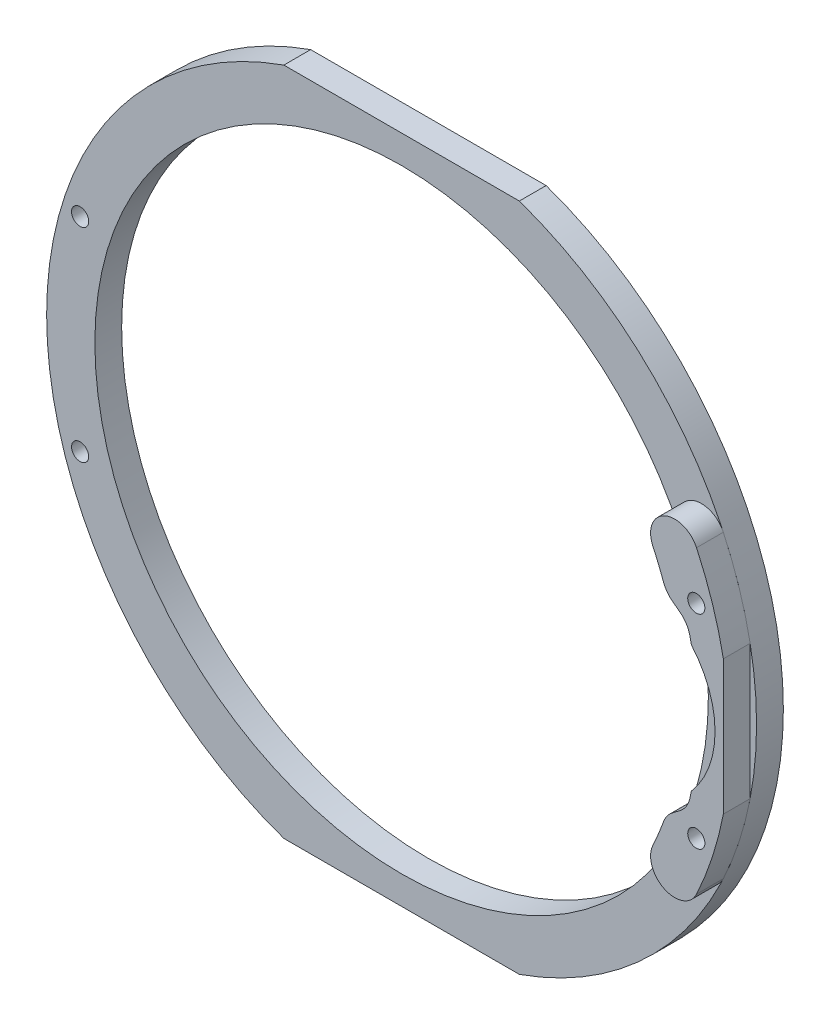
ISO-10303-21;
HEADER;
FILE_DESCRIPTION(('STEP AP214'),'2;1');
FILE_NAME('part.step','',(''),(''),'','','');
FILE_SCHEMA(('AUTOMOTIVE_DESIGN { 1 0 10303 214 1 1 1 1 }'));
ENDSEC;
DATA;
#1=APPLICATION_CONTEXT('core data for automotive mechanical design processes');
#2=APPLICATION_PROTOCOL_DEFINITION('international standard','automotive_design',2000,#1);
#3=PRODUCT_CONTEXT('',#1,'mechanical');
#4=PRODUCT('Part','Part','',(#3));
#5=PRODUCT_RELATED_PRODUCT_CATEGORY('part','',(#4));
#6=PRODUCT_DEFINITION_FORMATION('','',#4);
#7=PRODUCT_DEFINITION_CONTEXT('part definition',#1,'design');
#8=PRODUCT_DEFINITION('design','',#6,#7);
#9=PRODUCT_DEFINITION_SHAPE('','',#8);
#10=(LENGTH_UNIT() NAMED_UNIT(*) SI_UNIT(.MILLI.,.METRE.));
#11=(NAMED_UNIT(*) PLANE_ANGLE_UNIT() SI_UNIT($,.RADIAN.));
#12=(NAMED_UNIT(*) SI_UNIT($,.STERADIAN.) SOLID_ANGLE_UNIT());
#13=UNCERTAINTY_MEASURE_WITH_UNIT(LENGTH_MEASURE(1.E-05),#10,'distance_accuracy_value','');
#14=(GEOMETRIC_REPRESENTATION_CONTEXT(3) GLOBAL_UNCERTAINTY_ASSIGNED_CONTEXT((#13)) GLOBAL_UNIT_ASSIGNED_CONTEXT((#10,
#11,#12)) REPRESENTATION_CONTEXT('',''));
#15=CARTESIAN_POINT('',(0.,0.,0.));
#16=DIRECTION('',(0.,0.,1.));
#17=DIRECTION('',(1.,0.,0.));
#18=AXIS2_PLACEMENT_3D('',#15,#16,#17);
#19=CARTESIAN_POINT('',(0.,0.,9.21207128051794));
#20=DIRECTION('',(0.,0.,-1.));
#21=DIRECTION('',(-1.,0.,0.));
#22=AXIS2_PLACEMENT_3D('',#19,#20,#21);
#23=PLANE('',#22);
#24=CARTESIAN_POINT('',(59.9999999999999,19.,9.21207128051794));
#25=DIRECTION('',(0.,0.,1.));
#26=DIRECTION('',(1.,0.,0.));
#27=AXIS2_PLACEMENT_3D('',#24,#25,#26);
#28=CIRCLE('',#27,1.6);
#29=CARTESIAN_POINT('',(61.5999999999999,19.,9.21207128051794));
#30=VERTEX_POINT('',#29);
#31=EDGE_CURVE('E274',#30,#30,#28,.T.);
#32=ORIENTED_EDGE('',*,*,#31,.F.);
#33=EDGE_LOOP('',(#32));
#34=FACE_BOUND('',#33,.T.);
#35=CARTESIAN_POINT('',(60.,-19.,9.21207128051794));
#36=DIRECTION('',(0.,0.,1.));
#37=DIRECTION('',(1.,0.,0.));
#38=AXIS2_PLACEMENT_3D('',#35,#36,#37);
#39=CIRCLE('',#38,1.6);
#40=CARTESIAN_POINT('',(61.6,-19.,9.21207128051794));
#41=VERTEX_POINT('',#40);
#42=EDGE_CURVE('E247',#41,#41,#39,.T.);
#43=ORIENTED_EDGE('',*,*,#42,.F.);
#44=EDGE_LOOP('',(#43));
#45=FACE_BOUND('',#44,.T.);
#46=CARTESIAN_POINT('',(58.57099256057,-21.0832001951706,9.21207128051794));
#47=DIRECTION('',(0.,0.,1.));
#48=DIRECTION('',(1.,0.,0.));
#49=AXIS2_PLACEMENT_3D('',#46,#47,#48);
#50=CIRCLE('',#49,5.);
#51=CARTESIAN_POINT('',(53.8664951661467,-19.3897704606188,9.21207128051794));
#52=VERTEX_POINT('',#51);
#53=CARTESIAN_POINT('',(55.5739785892828,-17.0809624141399,9.21207128051794));
#54=VERTEX_POINT('',#53);
#55=EDGE_CURVE('E176',#52,#54,#50,.F.);
#56=ORIENTED_EDGE('',*,*,#55,.F.);
#57=CARTESIAN_POINT('',(-1.10140552696074E-13,0.,9.21207128051794));
#58=DIRECTION('',(0.,0.,-1.));
#59=DIRECTION('',(-1.,0.,0.));
#60=AXIS2_PLACEMENT_3D('',#57,#58,#59);
#61=CIRCLE('',#60,57.2500000000001);
#62=CARTESIAN_POINT('',(51.8861208078482,-24.1948954846551,9.21207128051794));
#63=VERTEX_POINT('',#62);
#64=EDGE_CURVE('E196',#52,#63,#61,.T.);
#65=ORIENTED_EDGE('',*,*,#64,.T.);
#66=CARTESIAN_POINT('',(55.9645058495131,-26.0966776624883,9.21207128051794));
#67=DIRECTION('',(0.,0.,1.));
#68=DIRECTION('',(-1.,0.,0.));
#69=AXIS2_PLACEMENT_3D('',#66,#67,#68);
#70=CIRCLE('',#69,4.50000000000002);
#71=CARTESIAN_POINT('',(60.042890891178,-27.9984598403214,9.21207128051794));
#72=VERTEX_POINT('',#71);
#73=EDGE_CURVE('E260',#63,#72,#70,.T.);
#74=ORIENTED_EDGE('',*,*,#73,.T.);
#75=CARTESIAN_POINT('',(0.,0.,9.21207128051794));
#76=DIRECTION('',(0.,0.,1.));
#77=DIRECTION('',(-1.,0.,0.));
#78=AXIS2_PLACEMENT_3D('',#75,#76,#77);
#79=CIRCLE('',#78,66.25);
#80=CARTESIAN_POINT('',(65.05,-12.5522906276106,9.21207128051794));
#81=VERTEX_POINT('',#80);
#82=EDGE_CURVE('E263',#72,#81,#79,.T.);
#83=ORIENTED_EDGE('',*,*,#82,.T.);
#84=DIRECTION('',(0.,1.,0.));
#85=VECTOR('',#84,1.);
#86=CARTESIAN_POINT('',(65.05,-12.5522906276106,9.21207128051794));
#87=LINE('',#86,#85);
#88=CARTESIAN_POINT('',(65.05,12.5522906276106,9.21207128051794));
#89=VERTEX_POINT('',#88);
#90=EDGE_CURVE('E266',#81,#89,#87,.T.);
#91=ORIENTED_EDGE('',*,*,#90,.T.);
#92=CARTESIAN_POINT('',(0.,0.,9.21207128051794));
#93=DIRECTION('',(0.,0.,1.));
#94=DIRECTION('',(-1.,0.,0.));
#95=AXIS2_PLACEMENT_3D('',#92,#93,#94);
#96=CIRCLE('',#95,66.25);
#97=CARTESIAN_POINT('',(60.042890891178,27.9984598403214,9.21207128051794));
#98=VERTEX_POINT('',#97);
#99=EDGE_CURVE('E198',#89,#98,#96,.T.);
#100=ORIENTED_EDGE('',*,*,#99,.T.);
#101=CARTESIAN_POINT('',(55.9645058495131,26.0966776624883,9.21207128051794));
#102=DIRECTION('',(0.,0.,1.));
#103=DIRECTION('',(1.,0.,0.));
#104=AXIS2_PLACEMENT_3D('',#101,#102,#103);
#105=CIRCLE('',#104,4.50000000000002);
#106=CARTESIAN_POINT('',(51.8861208078482,24.1948954846551,9.21207128051794));
#107=VERTEX_POINT('',#106);
#108=EDGE_CURVE('E191',#98,#107,#105,.T.);
#109=ORIENTED_EDGE('',*,*,#108,.T.);
#110=CARTESIAN_POINT('',(-1.10140552696074E-13,0.,9.21207128051794));
#111=DIRECTION('',(0.,0.,-1.));
#112=DIRECTION('',(-1.,0.,0.));
#113=AXIS2_PLACEMENT_3D('',#110,#111,#112);
#114=CIRCLE('',#113,57.2500000000001);
#115=CARTESIAN_POINT('',(53.8664951661467,19.3897704606188,9.21207128051794));
#116=VERTEX_POINT('',#115);
#117=EDGE_CURVE('E183',#107,#116,#114,.T.);
#118=ORIENTED_EDGE('',*,*,#117,.T.);
#119=CARTESIAN_POINT('',(58.57099256057,21.0832001951706,9.21207128051794));
#120=DIRECTION('',(0.,0.,1.));
#121=DIRECTION('',(1.,0.,0.));
#122=AXIS2_PLACEMENT_3D('',#119,#120,#121);
#123=CIRCLE('',#122,5.);
#124=CARTESIAN_POINT('',(55.5739785892828,17.0809624141399,9.21207128051794));
#125=VERTEX_POINT('',#124);
#126=EDGE_CURVE('E165',#125,#116,#123,.F.);
#127=ORIENTED_EDGE('',*,*,#126,.F.);
#128=DIRECTION('',(-0.800447556206134,0.599402794257441,0.));
#129=VECTOR('',#128,1.);
#130=CARTESIAN_POINT('',(58.3529133805673,15.,9.21207128051794));
#131=LINE('',#130,#129);
#132=CARTESIAN_POINT('',(56.9107570593106,16.0799364955455,9.21207128051794));
#133=VERTEX_POINT('',#132);
#134=EDGE_CURVE('E187',#133,#125,#131,.T.);
#135=ORIENTED_EDGE('',*,*,#134,.F.);
#136=CARTESIAN_POINT('',(53.9137430880234,12.0776987145149,9.21207128051794));
#137=DIRECTION('',(0.,0.,1.));
#138=DIRECTION('',(1.,0.,0.));
#139=AXIS2_PLACEMENT_3D('',#136,#137,#138);
#140=CIRCLE('',#139,5.);
#141=CARTESIAN_POINT('',(58.7928148606952,13.1707031230683,9.21207128051794));
#142=VERTEX_POINT('',#141);
#143=EDGE_CURVE('E186',#142,#133,#140,.T.);
#144=ORIENTED_EDGE('',*,*,#143,.F.);
#145=CARTESIAN_POINT('',(-1.73472347597681E-13,0.,9.21207128051794));
#146=DIRECTION('',(0.,0.,1.));
#147=DIRECTION('',(-1.,0.,0.));
#148=AXIS2_PLACEMENT_3D('',#145,#146,#147);
#149=CIRCLE('',#148,60.2500000000001);
#150=CARTESIAN_POINT('',(59.080357142857,11.8141398278694,9.21207128051794));
#151=VERTEX_POINT('',#150);
#152=EDGE_CURVE('E404',#151,#142,#149,.T.);
#153=ORIENTED_EDGE('',*,*,#152,.F.);
#154=CARTESIAN_POINT('',(45.4999999999999,0.,9.21207128051794));
#155=DIRECTION('',(0.,0.,-1.));
#156=DIRECTION('',(-1.,0.,0.));
#157=AXIS2_PLACEMENT_3D('',#154,#155,#156);
#158=CIRCLE('',#157,18.);
#159=CARTESIAN_POINT('',(59.080357142857,-11.8141398278693,9.21207128051794));
#160=VERTEX_POINT('',#159);
#161=EDGE_CURVE('E193',#151,#160,#158,.T.);
#162=ORIENTED_EDGE('',*,*,#161,.T.);
#163=CARTESIAN_POINT('',(58.7928148606952,-13.1707031230683,9.21207128051794));
#164=VERTEX_POINT('',#163);
#165=EDGE_CURVE('E215',#164,#160,#149,.T.);
#166=ORIENTED_EDGE('',*,*,#165,.F.);
#167=CARTESIAN_POINT('',(53.9137430880234,-12.0776987145149,9.21207128051794));
#168=DIRECTION('',(0.,0.,1.));
#169=DIRECTION('',(1.,0.,0.));
#170=AXIS2_PLACEMENT_3D('',#167,#168,#169);
#171=CIRCLE('',#170,5.);
#172=CARTESIAN_POINT('',(56.9107570593106,-16.0799364955456,9.21207128051794));
#173=VERTEX_POINT('',#172);
#174=EDGE_CURVE('E219',#173,#164,#171,.T.);
#175=ORIENTED_EDGE('',*,*,#174,.F.);
#176=DIRECTION('',(0.800447556206134,0.599402794257441,0.));
#177=VECTOR('',#176,1.);
#178=CARTESIAN_POINT('',(54.3466880315626,-18.,9.21207128051794));
#179=LINE('',#178,#177);
#180=EDGE_CURVE('E334',#54,#173,#179,.T.);
#181=ORIENTED_EDGE('',*,*,#180,.F.);
#182=EDGE_LOOP('',(#56,#65,#74,#83,#91,#100,#109,#118,#127,#135,#144,#153,#162,#166,#175,#181));
#183=FACE_BOUND('',#182,.T.);
#184=ADVANCED_FACE('F51',(#34,#45,#183),#23,.F.);
#185=CARTESIAN_POINT('',(0.,0.,4.21207128051794));
#186=DIRECTION('',(0.,0.,-1.));
#187=DIRECTION('',(-1.,0.,0.));
#188=AXIS2_PLACEMENT_3D('',#185,#186,#187);
#189=PLANE('',#188);
#190=CARTESIAN_POINT('',(59.9999999999999,19.,4.21207128051794));
#191=DIRECTION('',(0.,0.,1.));
#192=DIRECTION('',(1.,0.,0.));
#193=AXIS2_PLACEMENT_3D('',#190,#191,#192);
#194=CIRCLE('',#193,1.6);
#195=CARTESIAN_POINT('',(61.5999999999999,19.,4.21207128051794));
#196=VERTEX_POINT('',#195);
#197=EDGE_CURVE('E251',#196,#196,#194,.T.);
#198=ORIENTED_EDGE('',*,*,#197,.T.);
#199=EDGE_LOOP('',(#198));
#200=FACE_BOUND('',#199,.T.);
#201=CARTESIAN_POINT('',(60.,-19.,4.21207128051794));
#202=DIRECTION('',(0.,0.,1.));
#203=DIRECTION('',(1.,0.,0.));
#204=AXIS2_PLACEMENT_3D('',#201,#202,#203);
#205=CIRCLE('',#204,1.6);
#206=CARTESIAN_POINT('',(61.6,-19.,4.21207128051794));
#207=VERTEX_POINT('',#206);
#208=EDGE_CURVE('E246',#207,#207,#205,.T.);
#209=ORIENTED_EDGE('',*,*,#208,.T.);
#210=EDGE_LOOP('',(#209));
#211=FACE_BOUND('',#210,.T.);
#212=CARTESIAN_POINT('',(-1.10140552696074E-13,0.,4.21207128051794));
#213=DIRECTION('',(0.,0.,-1.));
#214=DIRECTION('',(-1.,0.,0.));
#215=AXIS2_PLACEMENT_3D('',#212,#213,#214);
#216=CIRCLE('',#215,57.2500000000001);
#217=CARTESIAN_POINT('',(53.8664951661468,-19.3897704606188,4.21207128051794));
#218=VERTEX_POINT('',#217);
#219=CARTESIAN_POINT('',(51.8861208078482,-24.1948954846551,4.21207128051794));
#220=VERTEX_POINT('',#219);
#221=EDGE_CURVE('E292',#218,#220,#216,.T.);
#222=ORIENTED_EDGE('',*,*,#221,.F.);
#223=CARTESIAN_POINT('',(58.57099256057,-21.0832001951706,4.21207128051794));
#224=DIRECTION('',(0.,0.,-1.));
#225=DIRECTION('',(-1.,0.,0.));
#226=AXIS2_PLACEMENT_3D('',#223,#224,#225);
#227=CIRCLE('',#226,5.);
#228=CARTESIAN_POINT('',(55.5739785892828,-17.0809624141399,4.21207128051794));
#229=VERTEX_POINT('',#228);
#230=EDGE_CURVE('E74',#218,#229,#227,.T.);
#231=ORIENTED_EDGE('',*,*,#230,.T.);
#232=DIRECTION('',(0.800447556206134,0.599402794257441,0.));
#233=VECTOR('',#232,1.);
#234=CARTESIAN_POINT('',(28.1621087225833,-37.6079179486131,4.21207128051794));
#235=LINE('',#234,#233);
#236=CARTESIAN_POINT('',(56.9107570593106,-16.0799364955456,4.21207128051794));
#237=VERTEX_POINT('',#236);
#238=EDGE_CURVE('E13',#229,#237,#235,.T.);
#239=ORIENTED_EDGE('',*,*,#238,.T.);
#240=CARTESIAN_POINT('',(53.9137430880234,-12.0776987145149,4.21207128051794));
#241=DIRECTION('',(0.,0.,-1.));
#242=DIRECTION('',(-1.,0.,0.));
#243=AXIS2_PLACEMENT_3D('',#240,#241,#242);
#244=CIRCLE('',#243,5.);
#245=CARTESIAN_POINT('',(58.7928148606952,-13.1707031230683,4.21207128051794));
#246=VERTEX_POINT('',#245);
#247=EDGE_CURVE('E59',#246,#237,#244,.T.);
#248=ORIENTED_EDGE('',*,*,#247,.F.);
#249=CARTESIAN_POINT('',(-1.73472347597681E-13,0.,4.21207128051794));
#250=DIRECTION('',(0.,0.,-1.));
#251=DIRECTION('',(-1.,0.,0.));
#252=AXIS2_PLACEMENT_3D('',#249,#250,#251);
#253=CIRCLE('',#252,60.2500000000001);
#254=CARTESIAN_POINT('',(59.080357142857,-11.8141398278693,4.21207128051794));
#255=VERTEX_POINT('',#254);
#256=EDGE_CURVE('E241',#246,#255,#253,.F.);
#257=ORIENTED_EDGE('',*,*,#256,.T.);
#258=CARTESIAN_POINT('',(45.4999999999999,0.,4.21207128051794));
#259=DIRECTION('',(0.,0.,-1.));
#260=DIRECTION('',(-1.,0.,0.));
#261=AXIS2_PLACEMENT_3D('',#258,#259,#260);
#262=CIRCLE('',#261,18.);
#263=CARTESIAN_POINT('',(59.080357142857,11.8141398278694,4.21207128051794));
#264=VERTEX_POINT('',#263);
#265=EDGE_CURVE('E289',#264,#255,#262,.T.);
#266=ORIENTED_EDGE('',*,*,#265,.F.);
#267=CARTESIAN_POINT('',(58.7928148606952,13.1707031230683,4.21207128051794));
#268=VERTEX_POINT('',#267);
#269=EDGE_CURVE('E66',#264,#268,#253,.F.);
#270=ORIENTED_EDGE('',*,*,#269,.T.);
#271=CARTESIAN_POINT('',(53.9137430880234,12.0776987145149,4.21207128051794));
#272=DIRECTION('',(0.,0.,-1.));
#273=DIRECTION('',(-1.,0.,0.));
#274=AXIS2_PLACEMENT_3D('',#271,#272,#273);
#275=CIRCLE('',#274,5.);
#276=CARTESIAN_POINT('',(56.9107570593106,16.0799364955455,4.21207128051794));
#277=VERTEX_POINT('',#276);
#278=EDGE_CURVE('E322',#277,#268,#275,.T.);
#279=ORIENTED_EDGE('',*,*,#278,.F.);
#280=DIRECTION('',(-0.800447556206134,0.599402794257441,0.));
#281=VECTOR('',#280,1.);
#282=CARTESIAN_POINT('',(28.1621087225833,37.6079179486131,4.21207128051794));
#283=LINE('',#282,#281);
#284=CARTESIAN_POINT('',(55.5739785892828,17.0809624141399,4.21207128051794));
#285=VERTEX_POINT('',#284);
#286=EDGE_CURVE('E319',#277,#285,#283,.T.);
#287=ORIENTED_EDGE('',*,*,#286,.T.);
#288=CARTESIAN_POINT('',(58.57099256057,21.0832001951706,4.21207128051794));
#289=DIRECTION('',(0.,0.,-1.));
#290=DIRECTION('',(-1.,0.,0.));
#291=AXIS2_PLACEMENT_3D('',#288,#289,#290);
#292=CIRCLE('',#291,5.);
#293=CARTESIAN_POINT('',(53.8664951661467,19.3897704606188,4.21207128051794));
#294=VERTEX_POINT('',#293);
#295=EDGE_CURVE('E244',#285,#294,#292,.T.);
#296=ORIENTED_EDGE('',*,*,#295,.T.);
#297=CARTESIAN_POINT('',(-1.10140552696074E-13,0.,4.21207128051794));
#298=DIRECTION('',(0.,0.,-1.));
#299=DIRECTION('',(-1.,0.,0.));
#300=AXIS2_PLACEMENT_3D('',#297,#298,#299);
#301=CIRCLE('',#300,57.2500000000001);
#302=CARTESIAN_POINT('',(51.8861208078482,24.1948954846551,4.21207128051794));
#303=VERTEX_POINT('',#302);
#304=EDGE_CURVE('E185',#303,#294,#301,.T.);
#305=ORIENTED_EDGE('',*,*,#304,.F.);
#306=CARTESIAN_POINT('',(55.9645058495131,26.0966776624883,4.21207128051794));
#307=DIRECTION('',(0.,0.,1.));
#308=DIRECTION('',(1.,0.,0.));
#309=AXIS2_PLACEMENT_3D('',#306,#307,#308);
#310=CIRCLE('',#309,4.50000000000002);
#311=CARTESIAN_POINT('',(60.042890891178,27.9984598403214,4.21207128051794));
#312=VERTEX_POINT('',#311);
#313=EDGE_CURVE('E281',#312,#303,#310,.T.);
#314=ORIENTED_EDGE('',*,*,#313,.F.);
#315=CARTESIAN_POINT('',(0.,0.,4.21207128051794));
#316=DIRECTION('',(0.,0.,1.));
#317=DIRECTION('',(-1.,0.,0.));
#318=AXIS2_PLACEMENT_3D('',#315,#316,#317);
#319=CIRCLE('',#318,66.25);
#320=CARTESIAN_POINT('',(65.05,12.5522906276106,4.21207128051794));
#321=VERTEX_POINT('',#320);
#322=EDGE_CURVE('E277',#321,#312,#319,.T.);
#323=ORIENTED_EDGE('',*,*,#322,.F.);
#324=DIRECTION('',(0.,1.,0.));
#325=VECTOR('',#324,1.);
#326=CARTESIAN_POINT('',(65.05,-12.5522906276106,4.21207128051794));
#327=LINE('',#326,#325);
#328=CARTESIAN_POINT('',(65.05,-12.5522906276106,4.21207128051794));
#329=VERTEX_POINT('',#328);
#330=EDGE_CURVE('E272',#329,#321,#327,.T.);
#331=ORIENTED_EDGE('',*,*,#330,.F.);
#332=CARTESIAN_POINT('',(0.,0.,4.21207128051794));
#333=DIRECTION('',(0.,0.,1.));
#334=DIRECTION('',(-1.,0.,0.));
#335=AXIS2_PLACEMENT_3D('',#332,#333,#334);
#336=CIRCLE('',#335,66.25);
#337=CARTESIAN_POINT('',(60.042890891178,-27.9984598403214,4.21207128051794));
#338=VERTEX_POINT('',#337);
#339=EDGE_CURVE('E296',#338,#329,#336,.T.);
#340=ORIENTED_EDGE('',*,*,#339,.F.);
#341=CARTESIAN_POINT('',(55.9645058495131,-26.0966776624883,4.21207128051794));
#342=DIRECTION('',(0.,0.,1.));
#343=DIRECTION('',(-1.,0.,0.));
#344=AXIS2_PLACEMENT_3D('',#341,#342,#343);
#345=CIRCLE('',#344,4.50000000000002);
#346=EDGE_CURVE('E294',#220,#338,#345,.T.);
#347=ORIENTED_EDGE('',*,*,#346,.F.);
#348=EDGE_LOOP('',(#222,#231,#239,#248,#257,#266,#270,#279,#287,#296,#305,#314,#323,#331,#340,#347));
#349=FACE_BOUND('',#348,.T.);
#350=ADVANCED_FACE('F337',(#200,#211,#349),#189,.T.);
#351=CARTESIAN_POINT('',(-1.10140552696074E-13,0.,9.21207128051794));
#352=DIRECTION('',(0.,0.,-1.));
#353=DIRECTION('',(-1.,0.,0.));
#354=AXIS2_PLACEMENT_3D('',#351,#352,#353);
#355=CYLINDRICAL_SURFACE('',#354,57.2500000000001);
#356=DIRECTION('',(0.,0.,-1.));
#357=VECTOR('',#356,1.);
#358=CARTESIAN_POINT('',(53.8664951661467,19.3897704606188,9.21207128051794));
#359=LINE('',#358,#357);
#360=EDGE_CURVE('E168',#116,#294,#359,.T.);
#361=ORIENTED_EDGE('',*,*,#360,.F.);
#362=ORIENTED_EDGE('',*,*,#117,.F.);
#363=DIRECTION('',(0.,0.,-1.));
#364=VECTOR('',#363,1.);
#365=CARTESIAN_POINT('',(51.8861208078482,24.1948954846551,9.21207128051794));
#366=LINE('',#365,#364);
#367=EDGE_CURVE('E310',#107,#303,#366,.T.);
#368=ORIENTED_EDGE('',*,*,#367,.T.);
#369=ORIENTED_EDGE('',*,*,#304,.T.);
#370=EDGE_LOOP('',(#361,#362,#368,#369));
#371=FACE_BOUND('',#370,.T.);
#372=ADVANCED_FACE('F181',(#371),#355,.F.);
#373=CARTESIAN_POINT('',(45.4999999999999,0.,9.21207128051794));
#374=DIRECTION('',(0.,0.,-1.));
#375=DIRECTION('',(-1.,0.,0.));
#376=AXIS2_PLACEMENT_3D('',#373,#374,#375);
#377=CYLINDRICAL_SURFACE('',#376,18.);
#378=DIRECTION('',(0.,0.,-1.));
#379=VECTOR('',#378,1.);
#380=CARTESIAN_POINT('',(59.080357142857,11.8141398278694,6.21207128051794));
#381=LINE('',#380,#379);
#382=EDGE_CURVE('E317',#264,#151,#381,.F.);
#383=ORIENTED_EDGE('',*,*,#382,.F.);
#384=ORIENTED_EDGE('',*,*,#265,.T.);
#385=DIRECTION('',(0.,0.,-1.));
#386=VECTOR('',#385,1.);
#387=CARTESIAN_POINT('',(59.080357142857,-11.8141398278693,6.21207128051794));
#388=LINE('',#387,#386);
#389=EDGE_CURVE('E315',#160,#255,#388,.T.);
#390=ORIENTED_EDGE('',*,*,#389,.F.);
#391=ORIENTED_EDGE('',*,*,#161,.F.);
#392=EDGE_LOOP('',(#383,#384,#390,#391));
#393=FACE_BOUND('',#392,.T.);
#394=ADVANCED_FACE('F387',(#393),#377,.F.);
#395=CARTESIAN_POINT('',(0.,0.,9.21207128051794));
#396=DIRECTION('',(0.,0.,-1.));
#397=DIRECTION('',(-1.,0.,0.));
#398=AXIS2_PLACEMENT_3D('',#395,#396,#397);
#399=CYLINDRICAL_SURFACE('',#398,66.25);
#400=ORIENTED_EDGE('',*,*,#322,.T.);
#401=DIRECTION('',(0.,0.,-1.));
#402=VECTOR('',#401,1.);
#403=CARTESIAN_POINT('',(60.042890891178,27.9984598403214,9.21207128051794));
#404=LINE('',#403,#402);
#405=EDGE_CURVE('E312',#98,#312,#404,.T.);
#406=ORIENTED_EDGE('',*,*,#405,.F.);
#407=ORIENTED_EDGE('',*,*,#99,.F.);
#408=DIRECTION('',(0.,0.,-1.));
#409=VECTOR('',#408,1.);
#410=CARTESIAN_POINT('',(65.05,12.5522906276106,9.21207128051794));
#411=LINE('',#410,#409);
#412=EDGE_CURVE('E299',#89,#321,#411,.T.);
#413=ORIENTED_EDGE('',*,*,#412,.T.);
#414=EDGE_LOOP('',(#400,#406,#407,#413));
#415=FACE_BOUND('',#414,.T.);
#416=ADVANCED_FACE('F53',(#415),#399,.T.);
#417=CARTESIAN_POINT('',(55.9645058495131,26.0966776624883,9.21207128051794));
#418=DIRECTION('',(0.,0.,-1.));
#419=DIRECTION('',(-1.,0.,0.));
#420=AXIS2_PLACEMENT_3D('',#417,#418,#419);
#421=CYLINDRICAL_SURFACE('',#420,4.50000000000002);
#422=ORIENTED_EDGE('',*,*,#313,.T.);
#423=ORIENTED_EDGE('',*,*,#367,.F.);
#424=ORIENTED_EDGE('',*,*,#108,.F.);
#425=ORIENTED_EDGE('',*,*,#405,.T.);
#426=EDGE_LOOP('',(#422,#423,#424,#425));
#427=FACE_BOUND('',#426,.T.);
#428=ADVANCED_FACE('F386',(#427),#421,.T.);
#429=CARTESIAN_POINT('',(-1.10140552696074E-13,0.,9.21207128051794));
#430=DIRECTION('',(0.,0.,-1.));
#431=DIRECTION('',(-1.,0.,0.));
#432=AXIS2_PLACEMENT_3D('',#429,#430,#431);
#433=CYLINDRICAL_SURFACE('',#432,57.2500000000001);
#434=ORIENTED_EDGE('',*,*,#64,.F.);
#435=DIRECTION('',(0.,0.,-1.));
#436=VECTOR('',#435,1.);
#437=CARTESIAN_POINT('',(53.8664951661467,-19.3897704606188,9.21207128051794));
#438=LINE('',#437,#436);
#439=EDGE_CURVE('E222',#218,#52,#438,.F.);
#440=ORIENTED_EDGE('',*,*,#439,.F.);
#441=ORIENTED_EDGE('',*,*,#221,.T.);
#442=DIRECTION('',(0.,0.,-1.));
#443=VECTOR('',#442,1.);
#444=CARTESIAN_POINT('',(51.8861208078482,-24.1948954846551,9.21207128051794));
#445=LINE('',#444,#443);
#446=EDGE_CURVE('E307',#63,#220,#445,.T.);
#447=ORIENTED_EDGE('',*,*,#446,.F.);
#448=EDGE_LOOP('',(#434,#440,#441,#447));
#449=FACE_BOUND('',#448,.T.);
#450=ADVANCED_FACE('F343',(#449),#433,.F.);
#451=CARTESIAN_POINT('',(55.9645058495131,-26.0966776624883,9.21207128051794));
#452=DIRECTION('',(0.,0.,-1.));
#453=DIRECTION('',(-1.,0.,0.));
#454=AXIS2_PLACEMENT_3D('',#451,#452,#453);
#455=CYLINDRICAL_SURFACE('',#454,4.50000000000002);
#456=ORIENTED_EDGE('',*,*,#346,.T.);
#457=DIRECTION('',(0.,0.,-1.));
#458=VECTOR('',#457,1.);
#459=CARTESIAN_POINT('',(60.042890891178,-27.9984598403214,9.21207128051794));
#460=LINE('',#459,#458);
#461=EDGE_CURVE('E304',#72,#338,#460,.T.);
#462=ORIENTED_EDGE('',*,*,#461,.F.);
#463=ORIENTED_EDGE('',*,*,#73,.F.);
#464=ORIENTED_EDGE('',*,*,#446,.T.);
#465=EDGE_LOOP('',(#456,#462,#463,#464));
#466=FACE_BOUND('',#465,.T.);
#467=ADVANCED_FACE('F346',(#466),#455,.T.);
#468=CARTESIAN_POINT('',(0.,0.,9.21207128051794));
#469=DIRECTION('',(0.,0.,-1.));
#470=DIRECTION('',(-1.,0.,0.));
#471=AXIS2_PLACEMENT_3D('',#468,#469,#470);
#472=CYLINDRICAL_SURFACE('',#471,66.25);
#473=ORIENTED_EDGE('',*,*,#339,.T.);
#474=DIRECTION('',(0.,0.,-1.));
#475=VECTOR('',#474,1.);
#476=CARTESIAN_POINT('',(65.05,-12.5522906276106,9.21207128051794));
#477=LINE('',#476,#475);
#478=EDGE_CURVE('E301',#81,#329,#477,.T.);
#479=ORIENTED_EDGE('',*,*,#478,.F.);
#480=ORIENTED_EDGE('',*,*,#82,.F.);
#481=ORIENTED_EDGE('',*,*,#461,.T.);
#482=EDGE_LOOP('',(#473,#479,#480,#481));
#483=FACE_BOUND('',#482,.T.);
#484=ADVANCED_FACE('F377',(#483),#472,.T.);
#485=CARTESIAN_POINT('',(65.05,-12.5522906276106,9.21207128051794));
#486=DIRECTION('',(-1.,0.,0.));
#487=DIRECTION('',(0.,0.,1.));
#488=AXIS2_PLACEMENT_3D('',#485,#486,#487);
#489=PLANE('',#488);
#490=ORIENTED_EDGE('',*,*,#330,.T.);
#491=ORIENTED_EDGE('',*,*,#412,.F.);
#492=ORIENTED_EDGE('',*,*,#90,.F.);
#493=ORIENTED_EDGE('',*,*,#478,.T.);
#494=EDGE_LOOP('',(#490,#491,#492,#493));
#495=FACE_BOUND('',#494,.T.);
#496=ADVANCED_FACE('F374',(#495),#489,.F.);
#497=CARTESIAN_POINT('',(59.9999999999999,19.,9.21207128051794));
#498=DIRECTION('',(0.,0.,-1.));
#499=DIRECTION('',(-1.,0.,0.));
#500=AXIS2_PLACEMENT_3D('',#497,#498,#499);
#501=CYLINDRICAL_SURFACE('',#500,1.6);
#502=ORIENTED_EDGE('',*,*,#31,.T.);
#503=EDGE_LOOP('',(#502));
#504=FACE_BOUND('',#503,.T.);
#505=ORIENTED_EDGE('',*,*,#197,.F.);
#506=EDGE_LOOP('',(#505));
#507=FACE_BOUND('',#506,.T.);
#508=ADVANCED_FACE('F371',(#504,#507),#501,.F.);
#509=CARTESIAN_POINT('',(60.,-19.,9.21207128051794));
#510=DIRECTION('',(0.,0.,-1.));
#511=DIRECTION('',(-1.,0.,0.));
#512=AXIS2_PLACEMENT_3D('',#509,#510,#511);
#513=CYLINDRICAL_SURFACE('',#512,1.6);
#514=ORIENTED_EDGE('',*,*,#42,.T.);
#515=EDGE_LOOP('',(#514));
#516=FACE_BOUND('',#515,.T.);
#517=ORIENTED_EDGE('',*,*,#208,.F.);
#518=EDGE_LOOP('',(#517));
#519=FACE_BOUND('',#518,.T.);
#520=ADVANCED_FACE('F414',(#516,#519),#513,.F.);
#521=CARTESIAN_POINT('',(-1.73472347597681E-13,0.,9.21207128051794));
#522=DIRECTION('',(0.,0.,-1.));
#523=DIRECTION('',(-1.,0.,0.));
#524=AXIS2_PLACEMENT_3D('',#521,#522,#523);
#525=CYLINDRICAL_SURFACE('',#524,60.2500000000001);
#526=DIRECTION('',(0.,0.,-1.));
#527=VECTOR('',#526,1.);
#528=CARTESIAN_POINT('',(58.7928148606952,-13.1707031230683,9.21207128051794));
#529=LINE('',#528,#527);
#530=EDGE_CURVE('E232',#164,#246,#529,.T.);
#531=ORIENTED_EDGE('',*,*,#530,.F.);
#532=ORIENTED_EDGE('',*,*,#165,.T.);
#533=ORIENTED_EDGE('',*,*,#389,.T.);
#534=ORIENTED_EDGE('',*,*,#256,.F.);
#535=EDGE_LOOP('',(#531,#532,#533,#534));
#536=FACE_BOUND('',#535,.T.);
#537=ADVANCED_FACE('F359',(#536),#525,.F.);
#538=CARTESIAN_POINT('',(53.9137430880234,-12.0776987145149,9.21207128051794));
#539=DIRECTION('',(0.,0.,-1.));
#540=DIRECTION('',(-1.,0.,0.));
#541=AXIS2_PLACEMENT_3D('',#538,#539,#540);
#542=CYLINDRICAL_SURFACE('',#541,5.);
#543=ORIENTED_EDGE('',*,*,#247,.T.);
#544=DIRECTION('',(0.,0.,-1.));
#545=VECTOR('',#544,1.);
#546=CARTESIAN_POINT('',(56.9107570593106,-16.0799364955456,9.21207128051794));
#547=LINE('',#546,#545);
#548=EDGE_CURVE('E226',#237,#173,#547,.F.);
#549=ORIENTED_EDGE('',*,*,#548,.T.);
#550=ORIENTED_EDGE('',*,*,#174,.T.);
#551=ORIENTED_EDGE('',*,*,#530,.T.);
#552=EDGE_LOOP('',(#543,#549,#550,#551));
#553=FACE_BOUND('',#552,.T.);
#554=ADVANCED_FACE('F326',(#553),#542,.F.);
#555=CARTESIAN_POINT('',(58.57099256057,-21.0832001951706,9.21207128051794));
#556=DIRECTION('',(0.,0.,-1.));
#557=DIRECTION('',(-1.,0.,0.));
#558=AXIS2_PLACEMENT_3D('',#555,#556,#557);
#559=CYLINDRICAL_SURFACE('',#558,5.);
#560=ORIENTED_EDGE('',*,*,#439,.T.);
#561=ORIENTED_EDGE('',*,*,#55,.T.);
#562=DIRECTION('',(0.,0.,1.));
#563=VECTOR('',#562,1.);
#564=CARTESIAN_POINT('',(55.5739785892828,-17.0809624141399,3.21207128051794));
#565=LINE('',#564,#563);
#566=EDGE_CURVE('E228',#54,#229,#565,.F.);
#567=ORIENTED_EDGE('',*,*,#566,.T.);
#568=ORIENTED_EDGE('',*,*,#230,.F.);
#569=EDGE_LOOP('',(#560,#561,#567,#568));
#570=FACE_BOUND('',#569,.T.);
#571=ADVANCED_FACE('F350',(#570),#559,.T.);
#572=CARTESIAN_POINT('',(54.3466880315626,-18.,9.21207128051794));
#573=DIRECTION('',(-0.599402794257441,0.800447556206134,0.));
#574=DIRECTION('',(-0.800447556206134,-0.599402794257441,0.));
#575=AXIS2_PLACEMENT_3D('',#572,#573,#574);
#576=PLANE('',#575);
#577=ORIENTED_EDGE('',*,*,#566,.F.);
#578=ORIENTED_EDGE('',*,*,#180,.T.);
#579=ORIENTED_EDGE('',*,*,#548,.F.);
#580=ORIENTED_EDGE('',*,*,#238,.F.);
#581=EDGE_LOOP('',(#577,#578,#579,#580));
#582=FACE_BOUND('',#581,.T.);
#583=ADVANCED_FACE('F332',(#582),#576,.T.);
#584=ORIENTED_EDGE('',*,*,#382,.T.);
#585=ORIENTED_EDGE('',*,*,#152,.T.);
#586=DIRECTION('',(0.,0.,-1.));
#587=VECTOR('',#586,1.);
#588=CARTESIAN_POINT('',(58.7928148606952,13.1707031230683,9.21207128051794));
#589=LINE('',#588,#587);
#590=EDGE_CURVE('E230',#268,#142,#589,.F.);
#591=ORIENTED_EDGE('',*,*,#590,.F.);
#592=ORIENTED_EDGE('',*,*,#269,.F.);
#593=EDGE_LOOP('',(#584,#585,#591,#592));
#594=FACE_BOUND('',#593,.T.);
#595=ADVANCED_FACE('F357',(#594),#525,.F.);
#596=CARTESIAN_POINT('',(58.3529133805673,15.,9.21207128051794));
#597=DIRECTION('',(-0.599402794257441,-0.800447556206134,0.));
#598=DIRECTION('',(0.800447556206134,-0.599402794257441,0.));
#599=AXIS2_PLACEMENT_3D('',#596,#597,#598);
#600=PLANE('',#599);
#601=DIRECTION('',(0.,0.,-1.));
#602=VECTOR('',#601,1.);
#603=CARTESIAN_POINT('',(56.9107570593106,16.0799364955455,9.21207128051794));
#604=LINE('',#603,#602);
#605=EDGE_CURVE('E236',#133,#277,#604,.T.);
#606=ORIENTED_EDGE('',*,*,#605,.F.);
#607=ORIENTED_EDGE('',*,*,#134,.T.);
#608=DIRECTION('',(0.,0.,1.));
#609=VECTOR('',#608,1.);
#610=CARTESIAN_POINT('',(55.5739785892828,17.0809624141399,9.21207128051794));
#611=LINE('',#610,#609);
#612=EDGE_CURVE('E171',#285,#125,#611,.T.);
#613=ORIENTED_EDGE('',*,*,#612,.F.);
#614=ORIENTED_EDGE('',*,*,#286,.F.);
#615=EDGE_LOOP('',(#606,#607,#613,#614));
#616=FACE_BOUND('',#615,.T.);
#617=ADVANCED_FACE('F400',(#616),#600,.T.);
#618=CARTESIAN_POINT('',(53.9137430880234,12.0776987145149,9.21207128051794));
#619=DIRECTION('',(0.,0.,-1.));
#620=DIRECTION('',(-1.,0.,0.));
#621=AXIS2_PLACEMENT_3D('',#618,#619,#620);
#622=CYLINDRICAL_SURFACE('',#621,5.);
#623=ORIENTED_EDGE('',*,*,#278,.T.);
#624=ORIENTED_EDGE('',*,*,#590,.T.);
#625=ORIENTED_EDGE('',*,*,#143,.T.);
#626=ORIENTED_EDGE('',*,*,#605,.T.);
#627=EDGE_LOOP('',(#623,#624,#625,#626));
#628=FACE_BOUND('',#627,.T.);
#629=ADVANCED_FACE('F407',(#628),#622,.F.);
#630=CARTESIAN_POINT('',(58.57099256057,21.0832001951706,9.21207128051794));
#631=DIRECTION('',(0.,0.,-1.));
#632=DIRECTION('',(-1.,0.,0.));
#633=AXIS2_PLACEMENT_3D('',#630,#631,#632);
#634=CYLINDRICAL_SURFACE('',#633,5.);
#635=ORIENTED_EDGE('',*,*,#612,.T.);
#636=ORIENTED_EDGE('',*,*,#126,.T.);
#637=ORIENTED_EDGE('',*,*,#360,.T.);
#638=ORIENTED_EDGE('',*,*,#295,.F.);
#639=EDGE_LOOP('',(#635,#636,#637,#638));
#640=FACE_BOUND('',#639,.T.);
#641=ADVANCED_FACE('F167',(#640),#634,.T.);
#642=CLOSED_SHELL('',(#184,#350,#372,#394,#416,#428,#450,#467,#484,#496,#508,#520,#537,#554,
#571,#583,#595,#617,#629,#641));
#643=MANIFOLD_SOLID_BREP('B2',#642);
#644=CARTESIAN_POINT('',(0.,0.,4.21207128051794));
#645=DIRECTION('',(0.,0.,1.));
#646=DIRECTION('',(1.,0.,0.));
#647=AXIS2_PLACEMENT_3D('',#644,#645,#646);
#648=PLANE('',#647);
#649=CARTESIAN_POINT('',(-60.0000000000001,19.,4.21207128051794));
#650=DIRECTION('',(0.,0.,1.));
#651=DIRECTION('',(1.,0.,0.));
#652=AXIS2_PLACEMENT_3D('',#649,#650,#651);
#653=CIRCLE('',#652,1.60000000000015);
#654=CARTESIAN_POINT('',(-58.4,19.,4.21207128051794));
#655=VERTEX_POINT('',#654);
#656=EDGE_CURVE('E662',#655,#655,#653,.T.);
#657=ORIENTED_EDGE('',*,*,#656,.F.);
#658=EDGE_LOOP('',(#657));
#659=FACE_BOUND('',#658,.T.);
#660=CARTESIAN_POINT('',(60.,-19.,4.21207128051794));
#661=DIRECTION('',(0.,0.,1.));
#662=DIRECTION('',(1.,0.,0.));
#663=AXIS2_PLACEMENT_3D('',#660,#661,#662);
#664=CIRCLE('',#663,1.6);
#665=CARTESIAN_POINT('',(61.6,-19.,4.21207128051794));
#666=VERTEX_POINT('',#665);
#667=EDGE_CURVE('E650',#666,#666,#664,.T.);
#668=ORIENTED_EDGE('',*,*,#667,.F.);
#669=EDGE_LOOP('',(#668));
#670=FACE_BOUND('',#669,.T.);
#671=CARTESIAN_POINT('',(0.,0.,4.21207128051794));
#672=DIRECTION('',(0.,0.,1.));
#673=DIRECTION('',(1.,0.,0.));
#674=AXIS2_PLACEMENT_3D('',#671,#672,#673);
#675=CIRCLE('',#674,66.25);
#676=CARTESIAN_POINT('',(-21.9729947890586,62.5,4.21207128051794));
#677=VERTEX_POINT('',#676);
#678=CARTESIAN_POINT('',(-21.9729947890586,-62.5,4.21207128051794));
#679=VERTEX_POINT('',#678);
#680=EDGE_CURVE('E620',#677,#679,#675,.T.);
#681=ORIENTED_EDGE('',*,*,#680,.T.);
#682=DIRECTION('',(1.,0.,0.));
#683=VECTOR('',#682,1.);
#684=CARTESIAN_POINT('',(-21.9729947890586,-62.5,4.21207128051794));
#685=LINE('',#684,#683);
#686=CARTESIAN_POINT('',(21.9729947890587,-62.5,4.21207128051794));
#687=VERTEX_POINT('',#686);
#688=EDGE_CURVE('E615',#679,#687,#685,.T.);
#689=ORIENTED_EDGE('',*,*,#688,.T.);
#690=CARTESIAN_POINT('',(0.,0.,4.21207128051794));
#691=DIRECTION('',(0.,0.,1.));
#692=DIRECTION('',(-1.,0.,0.));
#693=AXIS2_PLACEMENT_3D('',#690,#691,#692);
#694=CIRCLE('',#693,66.25);
#695=CARTESIAN_POINT('',(21.9729947890586,62.5,4.21207128051794));
#696=VERTEX_POINT('',#695);
#697=EDGE_CURVE('E618',#687,#696,#694,.T.);
#698=ORIENTED_EDGE('',*,*,#697,.T.);
#699=DIRECTION('',(-1.,0.,0.));
#700=VECTOR('',#699,1.);
#701=CARTESIAN_POINT('',(-21.9729947890586,62.5,4.21207128051794));
#702=LINE('',#701,#700);
#703=EDGE_CURVE('E585',#696,#677,#702,.T.);
#704=ORIENTED_EDGE('',*,*,#703,.T.);
#705=EDGE_LOOP('',(#681,#689,#698,#704));
#706=FACE_BOUND('',#705,.T.);
#707=CARTESIAN_POINT('',(59.9999999999999,19.,4.21207128051794));
#708=DIRECTION('',(0.,0.,1.));
#709=DIRECTION('',(1.,0.,0.));
#710=AXIS2_PLACEMENT_3D('',#707,#708,#709);
#711=CIRCLE('',#710,1.60000000000013);
#712=CARTESIAN_POINT('',(61.6,19.,4.21207128051794));
#713=VERTEX_POINT('',#712);
#714=EDGE_CURVE('E635',#713,#713,#711,.T.);
#715=ORIENTED_EDGE('',*,*,#714,.F.);
#716=EDGE_LOOP('',(#715));
#717=FACE_BOUND('',#716,.T.);
#718=CARTESIAN_POINT('',(-60.,-19.,4.21207128051794));
#719=DIRECTION('',(0.,0.,1.));
#720=DIRECTION('',(1.,0.,0.));
#721=AXIS2_PLACEMENT_3D('',#718,#719,#720);
#722=CIRCLE('',#721,1.6);
#723=CARTESIAN_POINT('',(-58.4,-19.,4.21207128051794));
#724=VERTEX_POINT('',#723);
#725=EDGE_CURVE('E656',#724,#724,#722,.T.);
#726=ORIENTED_EDGE('',*,*,#725,.F.);
#727=EDGE_LOOP('',(#726));
#728=FACE_BOUND('',#727,.T.);
#729=CARTESIAN_POINT('',(0.,0.,4.21207128051794));
#730=DIRECTION('',(0.,0.,1.));
#731=DIRECTION('',(1.,0.,0.));
#732=AXIS2_PLACEMENT_3D('',#729,#730,#731);
#733=CIRCLE('',#732,57.25);
#734=CARTESIAN_POINT('',(57.25,0.,4.21207128051794));
#735=VERTEX_POINT('',#734);
#736=EDGE_CURVE('E668',#735,#735,#733,.T.);
#737=ORIENTED_EDGE('',*,*,#736,.F.);
#738=EDGE_LOOP('',(#737));
#739=FACE_BOUND('',#738,.T.);
#740=ADVANCED_FACE('F568',(#659,#670,#706,#717,#728,#739),#648,.T.);
#741=CARTESIAN_POINT('',(0.,0.,-0.787928719482064));
#742=DIRECTION('',(0.,0.,1.));
#743=DIRECTION('',(1.,0.,0.));
#744=AXIS2_PLACEMENT_3D('',#741,#742,#743);
#745=PLANE('',#744);
#746=CARTESIAN_POINT('',(0.,0.,-0.787928719482064));
#747=DIRECTION('',(0.,0.,1.));
#748=DIRECTION('',(1.,0.,0.));
#749=AXIS2_PLACEMENT_3D('',#746,#747,#748);
#750=CIRCLE('',#749,66.25);
#751=CARTESIAN_POINT('',(-21.9729947890586,62.5,-0.787928719482064));
#752=VERTEX_POINT('',#751);
#753=CARTESIAN_POINT('',(-21.9729947890586,-62.5,-0.787928719482064));
#754=VERTEX_POINT('',#753);
#755=EDGE_CURVE('E632',#752,#754,#750,.T.);
#756=ORIENTED_EDGE('',*,*,#755,.F.);
#757=DIRECTION('',(-1.,0.,0.));
#758=VECTOR('',#757,1.);
#759=CARTESIAN_POINT('',(-21.9729947890586,62.5,-0.787928719482064));
#760=LINE('',#759,#758);
#761=CARTESIAN_POINT('',(21.9729947890586,62.5,-0.787928719482064));
#762=VERTEX_POINT('',#761);
#763=EDGE_CURVE('E608',#762,#752,#760,.T.);
#764=ORIENTED_EDGE('',*,*,#763,.F.);
#765=CARTESIAN_POINT('',(0.,0.,-0.787928719482064));
#766=DIRECTION('',(0.,0.,1.));
#767=DIRECTION('',(-1.,0.,0.));
#768=AXIS2_PLACEMENT_3D('',#765,#766,#767);
#769=CIRCLE('',#768,66.25);
#770=CARTESIAN_POINT('',(21.9729947890587,-62.5,-0.787928719482064));
#771=VERTEX_POINT('',#770);
#772=EDGE_CURVE('E602',#771,#762,#769,.T.);
#773=ORIENTED_EDGE('',*,*,#772,.F.);
#774=DIRECTION('',(1.,0.,0.));
#775=VECTOR('',#774,1.);
#776=CARTESIAN_POINT('',(-21.9729947890586,-62.5,-0.787928719482064));
#777=LINE('',#776,#775);
#778=EDGE_CURVE('E624',#754,#771,#777,.T.);
#779=ORIENTED_EDGE('',*,*,#778,.F.);
#780=EDGE_LOOP('',(#756,#764,#773,#779));
#781=FACE_BOUND('',#780,.T.);
#782=CARTESIAN_POINT('',(59.9999999999999,19.,-0.787928719482064));
#783=DIRECTION('',(0.,0.,1.));
#784=DIRECTION('',(1.,0.,0.));
#785=AXIS2_PLACEMENT_3D('',#782,#783,#784);
#786=CIRCLE('',#785,1.60000000000013);
#787=CARTESIAN_POINT('',(61.6,19.,-0.787928719482064));
#788=VERTEX_POINT('',#787);
#789=EDGE_CURVE('E647',#788,#788,#786,.T.);
#790=ORIENTED_EDGE('',*,*,#789,.T.);
#791=EDGE_LOOP('',(#790));
#792=FACE_BOUND('',#791,.T.);
#793=CARTESIAN_POINT('',(60.,-19.,-0.787928719482064));
#794=DIRECTION('',(0.,0.,1.));
#795=DIRECTION('',(1.,0.,0.));
#796=AXIS2_PLACEMENT_3D('',#793,#794,#795);
#797=CIRCLE('',#796,1.6);
#798=CARTESIAN_POINT('',(61.6,-19.,-0.787928719482064));
#799=VERTEX_POINT('',#798);
#800=EDGE_CURVE('E653',#799,#799,#797,.T.);
#801=ORIENTED_EDGE('',*,*,#800,.T.);
#802=EDGE_LOOP('',(#801));
#803=FACE_BOUND('',#802,.T.);
#804=CARTESIAN_POINT('',(-60.,-19.,-0.787928719482064));
#805=DIRECTION('',(0.,0.,1.));
#806=DIRECTION('',(1.,0.,0.));
#807=AXIS2_PLACEMENT_3D('',#804,#805,#806);
#808=CIRCLE('',#807,1.6);
#809=CARTESIAN_POINT('',(-58.4,-19.,-0.787928719482064));
#810=VERTEX_POINT('',#809);
#811=EDGE_CURVE('E659',#810,#810,#808,.T.);
#812=ORIENTED_EDGE('',*,*,#811,.T.);
#813=EDGE_LOOP('',(#812));
#814=FACE_BOUND('',#813,.T.);
#815=CARTESIAN_POINT('',(-60.0000000000001,19.,-0.787928719482064));
#816=DIRECTION('',(0.,0.,1.));
#817=DIRECTION('',(1.,0.,0.));
#818=AXIS2_PLACEMENT_3D('',#815,#816,#817);
#819=CIRCLE('',#818,1.60000000000015);
#820=CARTESIAN_POINT('',(-58.4,19.,-0.787928719482064));
#821=VERTEX_POINT('',#820);
#822=EDGE_CURVE('E665',#821,#821,#819,.T.);
#823=ORIENTED_EDGE('',*,*,#822,.T.);
#824=EDGE_LOOP('',(#823));
#825=FACE_BOUND('',#824,.T.);
#826=CARTESIAN_POINT('',(0.,0.,-0.787928719482064));
#827=DIRECTION('',(0.,0.,1.));
#828=DIRECTION('',(1.,0.,0.));
#829=AXIS2_PLACEMENT_3D('',#826,#827,#828);
#830=CIRCLE('',#829,57.25);
#831=CARTESIAN_POINT('',(57.25,0.,-0.787928719482064));
#832=VERTEX_POINT('',#831);
#833=EDGE_CURVE('E671',#832,#832,#830,.T.);
#834=ORIENTED_EDGE('',*,*,#833,.T.);
#835=EDGE_LOOP('',(#834));
#836=FACE_BOUND('',#835,.T.);
#837=ADVANCED_FACE('F643',(#781,#792,#803,#814,#825,#836),#745,.F.);
#838=CARTESIAN_POINT('',(0.,0.,4.21207128051794));
#839=DIRECTION('',(0.,0.,-1.));
#840=DIRECTION('',(-1.,0.,0.));
#841=AXIS2_PLACEMENT_3D('',#838,#839,#840);
#842=CYLINDRICAL_SURFACE('',#841,66.25);
#843=ORIENTED_EDGE('',*,*,#755,.T.);
#844=DIRECTION('',(0.,0.,-1.));
#845=VECTOR('',#844,1.);
#846=CARTESIAN_POINT('',(-21.9729947890586,-62.5,4.21207128051794));
#847=LINE('',#846,#845);
#848=EDGE_CURVE('E49',#679,#754,#847,.T.);
#849=ORIENTED_EDGE('',*,*,#848,.F.);
#850=ORIENTED_EDGE('',*,*,#680,.F.);
#851=DIRECTION('',(0.,0.,-1.));
#852=VECTOR('',#851,1.);
#853=CARTESIAN_POINT('',(-21.9729947890586,62.5,4.21207128051794));
#854=LINE('',#853,#852);
#855=EDGE_CURVE('E628',#677,#752,#854,.T.);
#856=ORIENTED_EDGE('',*,*,#855,.T.);
#857=EDGE_LOOP('',(#843,#849,#850,#856));
#858=FACE_BOUND('',#857,.T.);
#859=ADVANCED_FACE('F570',(#858),#842,.T.);
#860=CARTESIAN_POINT('',(-21.9729947890586,-62.5,4.21207128051794));
#861=DIRECTION('',(0.,1.,0.));
#862=DIRECTION('',(0.,0.,1.));
#863=AXIS2_PLACEMENT_3D('',#860,#861,#862);
#864=PLANE('',#863);
#865=ORIENTED_EDGE('',*,*,#778,.T.);
#866=DIRECTION('',(0.,0.,-1.));
#867=VECTOR('',#866,1.);
#868=CARTESIAN_POINT('',(21.9729947890587,-62.5,4.21207128051794));
#869=LINE('',#868,#867);
#870=EDGE_CURVE('E577',#687,#771,#869,.T.);
#871=ORIENTED_EDGE('',*,*,#870,.F.);
#872=ORIENTED_EDGE('',*,*,#688,.F.);
#873=ORIENTED_EDGE('',*,*,#848,.T.);
#874=EDGE_LOOP('',(#865,#871,#872,#873));
#875=FACE_BOUND('',#874,.T.);
#876=ADVANCED_FACE('F623',(#875),#864,.F.);
#877=CARTESIAN_POINT('',(0.,0.,4.21207128051794));
#878=DIRECTION('',(0.,0.,-1.));
#879=DIRECTION('',(-1.,0.,0.));
#880=AXIS2_PLACEMENT_3D('',#877,#878,#879);
#881=CYLINDRICAL_SURFACE('',#880,66.25);
#882=ORIENTED_EDGE('',*,*,#772,.T.);
#883=DIRECTION('',(0.,0.,-1.));
#884=VECTOR('',#883,1.);
#885=CARTESIAN_POINT('',(21.9729947890586,62.5,4.21207128051794));
#886=LINE('',#885,#884);
#887=EDGE_CURVE('E625',#696,#762,#886,.T.);
#888=ORIENTED_EDGE('',*,*,#887,.F.);
#889=ORIENTED_EDGE('',*,*,#697,.F.);
#890=ORIENTED_EDGE('',*,*,#870,.T.);
#891=EDGE_LOOP('',(#882,#888,#889,#890));
#892=FACE_BOUND('',#891,.T.);
#893=ADVANCED_FACE('F626',(#892),#881,.T.);
#894=CARTESIAN_POINT('',(-21.9729947890586,62.5,4.21207128051794));
#895=DIRECTION('',(0.,-1.,0.));
#896=DIRECTION('',(0.,0.,-1.));
#897=AXIS2_PLACEMENT_3D('',#894,#895,#896);
#898=PLANE('',#897);
#899=ORIENTED_EDGE('',*,*,#763,.T.);
#900=ORIENTED_EDGE('',*,*,#855,.F.);
#901=ORIENTED_EDGE('',*,*,#703,.F.);
#902=ORIENTED_EDGE('',*,*,#887,.T.);
#903=EDGE_LOOP('',(#899,#900,#901,#902));
#904=FACE_BOUND('',#903,.T.);
#905=ADVANCED_FACE('F640',(#904),#898,.F.);
#906=CARTESIAN_POINT('',(59.9999999999999,19.,4.21207128051794));
#907=DIRECTION('',(0.,0.,-1.));
#908=DIRECTION('',(-1.,0.,0.));
#909=AXIS2_PLACEMENT_3D('',#906,#907,#908);
#910=CYLINDRICAL_SURFACE('',#909,1.60000000000013);
#911=ORIENTED_EDGE('',*,*,#714,.T.);
#912=EDGE_LOOP('',(#911));
#913=FACE_BOUND('',#912,.T.);
#914=ORIENTED_EDGE('',*,*,#789,.F.);
#915=EDGE_LOOP('',(#914));
#916=FACE_BOUND('',#915,.T.);
#917=ADVANCED_FACE('F690',(#913,#916),#910,.F.);
#918=CARTESIAN_POINT('',(60.,-19.,4.21207128051794));
#919=DIRECTION('',(0.,0.,-1.));
#920=DIRECTION('',(-1.,0.,0.));
#921=AXIS2_PLACEMENT_3D('',#918,#919,#920);
#922=CYLINDRICAL_SURFACE('',#921,1.6);
#923=ORIENTED_EDGE('',*,*,#667,.T.);
#924=EDGE_LOOP('',(#923));
#925=FACE_BOUND('',#924,.T.);
#926=ORIENTED_EDGE('',*,*,#800,.F.);
#927=EDGE_LOOP('',(#926));
#928=FACE_BOUND('',#927,.T.);
#929=ADVANCED_FACE('F725',(#925,#928),#922,.F.);
#930=CARTESIAN_POINT('',(-60.,-19.,4.21207128051794));
#931=DIRECTION('',(0.,0.,-1.));
#932=DIRECTION('',(-1.,0.,0.));
#933=AXIS2_PLACEMENT_3D('',#930,#931,#932);
#934=CYLINDRICAL_SURFACE('',#933,1.6);
#935=ORIENTED_EDGE('',*,*,#725,.T.);
#936=EDGE_LOOP('',(#935));
#937=FACE_BOUND('',#936,.T.);
#938=ORIENTED_EDGE('',*,*,#811,.F.);
#939=EDGE_LOOP('',(#938));
#940=FACE_BOUND('',#939,.T.);
#941=ADVANCED_FACE('F732',(#937,#940),#934,.F.);
#942=CARTESIAN_POINT('',(-60.0000000000001,19.,4.21207128051794));
#943=DIRECTION('',(0.,0.,-1.));
#944=DIRECTION('',(-1.,0.,0.));
#945=AXIS2_PLACEMENT_3D('',#942,#943,#944);
#946=CYLINDRICAL_SURFACE('',#945,1.60000000000015);
#947=ORIENTED_EDGE('',*,*,#656,.T.);
#948=EDGE_LOOP('',(#947));
#949=FACE_BOUND('',#948,.T.);
#950=ORIENTED_EDGE('',*,*,#822,.F.);
#951=EDGE_LOOP('',(#950));
#952=FACE_BOUND('',#951,.T.);
#953=ADVANCED_FACE('F739',(#949,#952),#946,.F.);
#954=CARTESIAN_POINT('',(0.,0.,4.21207128051794));
#955=DIRECTION('',(0.,0.,-1.));
#956=DIRECTION('',(-1.,0.,0.));
#957=AXIS2_PLACEMENT_3D('',#954,#955,#956);
#958=CYLINDRICAL_SURFACE('',#957,57.25);
#959=ORIENTED_EDGE('',*,*,#736,.T.);
#960=EDGE_LOOP('',(#959));
#961=FACE_BOUND('',#960,.T.);
#962=ORIENTED_EDGE('',*,*,#833,.F.);
#963=EDGE_LOOP('',(#962));
#964=FACE_BOUND('',#963,.T.);
#965=ADVANCED_FACE('F677',(#961,#964),#958,.F.);
#966=CLOSED_SHELL('',(#740,#837,#859,#876,#893,#905,#917,#929,#941,#953,#965));
#967=MANIFOLD_SOLID_BREP('B7_NOT_SHOWN',#966);
#968=ADVANCED_BREP_SHAPE_REPRESENTATION('',(#18,#643,#967),#14);
#969=SHAPE_DEFINITION_REPRESENTATION(#9,#968);
ENDSEC;
END-ISO-10303-21;
